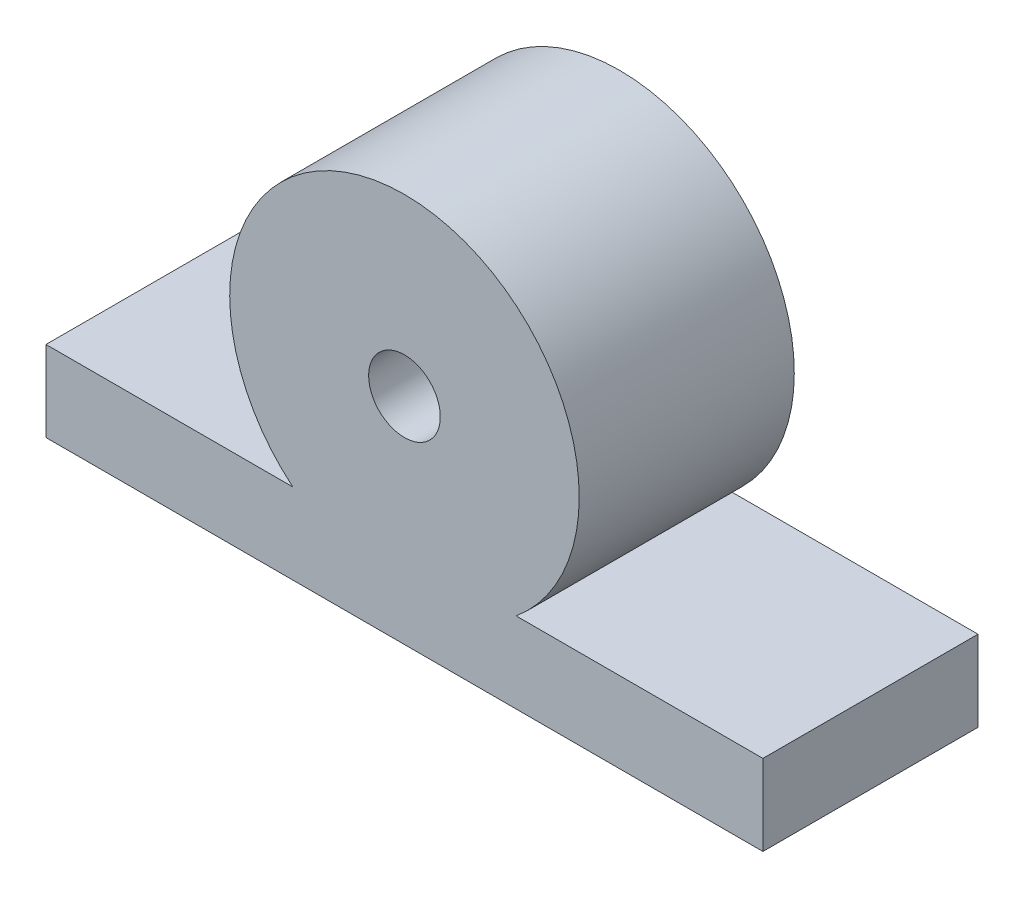
ISO-10303-21;
HEADER;
FILE_DESCRIPTION(('STEP AP214'),'2;1');
FILE_NAME('part.step','',(''),(''),'','','');
FILE_SCHEMA(('AUTOMOTIVE_DESIGN { 1 0 10303 214 1 1 1 1 }'));
ENDSEC;
DATA;
#1=APPLICATION_CONTEXT('core data for automotive mechanical design processes');
#2=APPLICATION_PROTOCOL_DEFINITION('international standard','automotive_design',2000,#1);
#3=PRODUCT_CONTEXT('',#1,'mechanical');
#4=PRODUCT('Part','Part','',(#3));
#5=PRODUCT_RELATED_PRODUCT_CATEGORY('part','',(#4));
#6=PRODUCT_DEFINITION_FORMATION('','',#4);
#7=PRODUCT_DEFINITION_CONTEXT('part definition',#1,'design');
#8=PRODUCT_DEFINITION('design','',#6,#7);
#9=PRODUCT_DEFINITION_SHAPE('','',#8);
#10=(LENGTH_UNIT() NAMED_UNIT(*) SI_UNIT(.MILLI.,.METRE.));
#11=(NAMED_UNIT(*) PLANE_ANGLE_UNIT() SI_UNIT($,.RADIAN.));
#12=(NAMED_UNIT(*) SI_UNIT($,.STERADIAN.) SOLID_ANGLE_UNIT());
#13=UNCERTAINTY_MEASURE_WITH_UNIT(LENGTH_MEASURE(1.E-05),#10,'distance_accuracy_value','');
#14=(GEOMETRIC_REPRESENTATION_CONTEXT(3) GLOBAL_UNCERTAINTY_ASSIGNED_CONTEXT((#13)) GLOBAL_UNIT_ASSIGNED_CONTEXT((#10,
#11,#12)) REPRESENTATION_CONTEXT('',''));
#15=CARTESIAN_POINT('',(0.,0.,0.));
#16=DIRECTION('',(0.,0.,1.));
#17=DIRECTION('',(1.,0.,0.));
#18=AXIS2_PLACEMENT_3D('',#15,#16,#17);
#19=CARTESIAN_POINT('',(0.,38.1,38.1));
#20=DIRECTION('',(0.,0.,-1.));
#21=DIRECTION('',(-1.,0.,0.));
#22=AXIS2_PLACEMENT_3D('',#19,#20,#21);
#23=CYLINDRICAL_SURFACE('',#22,30.95625);
#24=CARTESIAN_POINT('',(0.,38.1,0.));
#25=DIRECTION('',(0.,0.,1.));
#26=DIRECTION('',(1.,0.,0.));
#27=AXIS2_PLACEMENT_3D('',#24,#25,#26);
#28=CIRCLE('',#27,30.95625);
#29=CARTESIAN_POINT('',(19.7801480735737,14.2875,0.));
#30=VERTEX_POINT('',#29);
#31=CARTESIAN_POINT('',(-19.7801480735737,14.2875,0.));
#32=VERTEX_POINT('',#31);
#33=EDGE_CURVE('E123',#30,#32,#28,.T.);
#34=ORIENTED_EDGE('',*,*,#33,.T.);
#35=DIRECTION('',(0.,0.,-1.));
#36=VECTOR('',#35,1.);
#37=CARTESIAN_POINT('',(-19.7801480735737,14.2875,38.1));
#38=LINE('',#37,#36);
#39=CARTESIAN_POINT('',(-19.7801480735737,14.2875,38.1));
#40=VERTEX_POINT('',#39);
#41=EDGE_CURVE('E11',#40,#32,#38,.T.);
#42=ORIENTED_EDGE('',*,*,#41,.F.);
#43=CARTESIAN_POINT('',(0.,38.1,38.1));
#44=DIRECTION('',(0.,0.,1.));
#45=DIRECTION('',(1.,0.,0.));
#46=AXIS2_PLACEMENT_3D('',#43,#44,#45);
#47=CIRCLE('',#46,30.95625);
#48=CARTESIAN_POINT('',(19.7801480735737,14.2875,38.1));
#49=VERTEX_POINT('',#48);
#50=EDGE_CURVE('E85',#49,#40,#47,.T.);
#51=ORIENTED_EDGE('',*,*,#50,.F.);
#52=DIRECTION('',(0.,0.,-1.));
#53=VECTOR('',#52,1.);
#54=CARTESIAN_POINT('',(19.7801480735737,14.2875,38.1));
#55=LINE('',#54,#53);
#56=EDGE_CURVE('E54',#49,#30,#55,.T.);
#57=ORIENTED_EDGE('',*,*,#56,.T.);
#58=EDGE_LOOP('',(#34,#42,#51,#57));
#59=FACE_BOUND('',#58,.T.);
#60=ADVANCED_FACE('F37',(#59),#23,.T.);
#61=CARTESIAN_POINT('',(0.,14.2875,38.1));
#62=DIRECTION('',(0.,1.,0.));
#63=DIRECTION('',(-1.,0.,0.));
#64=AXIS2_PLACEMENT_3D('',#61,#62,#63);
#65=PLANE('',#64);
#66=DIRECTION('',(1.,0.,0.));
#67=VECTOR('',#66,1.);
#68=CARTESIAN_POINT('',(0.,14.2875,0.));
#69=LINE('',#68,#67);
#70=CARTESIAN_POINT('',(-63.5,14.2875,0.));
#71=VERTEX_POINT('',#70);
#72=EDGE_CURVE('E125',#71,#32,#69,.T.);
#73=ORIENTED_EDGE('',*,*,#72,.F.);
#74=DIRECTION('',(0.,0.,-1.));
#75=VECTOR('',#74,1.);
#76=CARTESIAN_POINT('',(-63.5,14.2875,38.1));
#77=LINE('',#76,#75);
#78=CARTESIAN_POINT('',(-63.5,14.2875,38.1));
#79=VERTEX_POINT('',#78);
#80=EDGE_CURVE('E46',#79,#71,#77,.T.);
#81=ORIENTED_EDGE('',*,*,#80,.F.);
#82=DIRECTION('',(1.,0.,0.));
#83=VECTOR('',#82,1.);
#84=CARTESIAN_POINT('',(0.,14.2875,38.1));
#85=LINE('',#84,#83);
#86=EDGE_CURVE('E249',#79,#40,#85,.T.);
#87=ORIENTED_EDGE('',*,*,#86,.T.);
#88=ORIENTED_EDGE('',*,*,#41,.T.);
#89=EDGE_LOOP('',(#73,#81,#87,#88));
#90=FACE_BOUND('',#89,.T.);
#91=ADVANCED_FACE('F146',(#90),#65,.T.);
#92=CARTESIAN_POINT('',(-63.5,0.,38.1));
#93=DIRECTION('',(-1.,0.,0.));
#94=DIRECTION('',(0.,0.,1.));
#95=AXIS2_PLACEMENT_3D('',#92,#93,#94);
#96=PLANE('',#95);
#97=DIRECTION('',(0.,1.,0.));
#98=VECTOR('',#97,1.);
#99=CARTESIAN_POINT('',(-63.5,0.,0.));
#100=LINE('',#99,#98);
#101=CARTESIAN_POINT('',(-63.5,0.,0.));
#102=VERTEX_POINT('',#101);
#103=EDGE_CURVE('E128',#102,#71,#100,.T.);
#104=ORIENTED_EDGE('',*,*,#103,.F.);
#105=DIRECTION('',(0.,0.,-1.));
#106=VECTOR('',#105,1.);
#107=CARTESIAN_POINT('',(-63.5,0.,38.1));
#108=LINE('',#107,#106);
#109=CARTESIAN_POINT('',(-63.5,0.,38.1));
#110=VERTEX_POINT('',#109);
#111=EDGE_CURVE('E112',#110,#102,#108,.T.);
#112=ORIENTED_EDGE('',*,*,#111,.F.);
#113=DIRECTION('',(0.,1.,0.));
#114=VECTOR('',#113,1.);
#115=CARTESIAN_POINT('',(-63.5,0.,38.1));
#116=LINE('',#115,#114);
#117=EDGE_CURVE('E102',#110,#79,#116,.T.);
#118=ORIENTED_EDGE('',*,*,#117,.T.);
#119=ORIENTED_EDGE('',*,*,#80,.T.);
#120=EDGE_LOOP('',(#104,#112,#118,#119));
#121=FACE_BOUND('',#120,.T.);
#122=ADVANCED_FACE('F143',(#121),#96,.T.);
#123=CARTESIAN_POINT('',(0.,0.,38.1));
#124=DIRECTION('',(0.,1.,0.));
#125=DIRECTION('',(-1.,0.,0.));
#126=AXIS2_PLACEMENT_3D('',#123,#124,#125);
#127=PLANE('',#126);
#128=DIRECTION('',(1.,0.,0.));
#129=VECTOR('',#128,1.);
#130=CARTESIAN_POINT('',(0.,0.,0.));
#131=LINE('',#130,#129);
#132=CARTESIAN_POINT('',(63.5,0.,0.));
#133=VERTEX_POINT('',#132);
#134=EDGE_CURVE('E109',#102,#133,#131,.T.);
#135=ORIENTED_EDGE('',*,*,#134,.T.);
#136=DIRECTION('',(0.,0.,-1.));
#137=VECTOR('',#136,1.);
#138=CARTESIAN_POINT('',(63.5,0.,38.1));
#139=LINE('',#138,#137);
#140=CARTESIAN_POINT('',(63.5,0.,38.1));
#141=VERTEX_POINT('',#140);
#142=EDGE_CURVE('E106',#141,#133,#139,.T.);
#143=ORIENTED_EDGE('',*,*,#142,.F.);
#144=DIRECTION('',(1.,0.,0.));
#145=VECTOR('',#144,1.);
#146=CARTESIAN_POINT('',(0.,0.,38.1));
#147=LINE('',#146,#145);
#148=EDGE_CURVE('E96',#110,#141,#147,.T.);
#149=ORIENTED_EDGE('',*,*,#148,.F.);
#150=ORIENTED_EDGE('',*,*,#111,.T.);
#151=EDGE_LOOP('',(#135,#143,#149,#150));
#152=FACE_BOUND('',#151,.T.);
#153=ADVANCED_FACE('F107',(#152),#127,.F.);
#154=CARTESIAN_POINT('',(63.5,0.,38.1));
#155=DIRECTION('',(1.,0.,0.));
#156=DIRECTION('',(0.,0.,-1.));
#157=AXIS2_PLACEMENT_3D('',#154,#155,#156);
#158=PLANE('',#157);
#159=DIRECTION('',(0.,-1.,0.));
#160=VECTOR('',#159,1.);
#161=CARTESIAN_POINT('',(63.5,0.,0.));
#162=LINE('',#161,#160);
#163=CARTESIAN_POINT('',(63.5,14.2875,0.));
#164=VERTEX_POINT('',#163);
#165=EDGE_CURVE('E132',#164,#133,#162,.T.);
#166=ORIENTED_EDGE('',*,*,#165,.F.);
#167=DIRECTION('',(0.,0.,-1.));
#168=VECTOR('',#167,1.);
#169=CARTESIAN_POINT('',(63.5,14.2875,38.1));
#170=LINE('',#169,#168);
#171=CARTESIAN_POINT('',(63.5,14.2875,38.1));
#172=VERTEX_POINT('',#171);
#173=EDGE_CURVE('E73',#172,#164,#170,.T.);
#174=ORIENTED_EDGE('',*,*,#173,.F.);
#175=DIRECTION('',(0.,-1.,0.));
#176=VECTOR('',#175,1.);
#177=CARTESIAN_POINT('',(63.5,0.,38.1));
#178=LINE('',#177,#176);
#179=EDGE_CURVE('E100',#172,#141,#178,.T.);
#180=ORIENTED_EDGE('',*,*,#179,.T.);
#181=ORIENTED_EDGE('',*,*,#142,.T.);
#182=EDGE_LOOP('',(#166,#174,#180,#181));
#183=FACE_BOUND('',#182,.T.);
#184=ADVANCED_FACE('F114',(#183),#158,.T.);
#185=CARTESIAN_POINT('',(0.,38.1,38.1));
#186=DIRECTION('',(0.,0.,-1.));
#187=DIRECTION('',(-1.,0.,0.));
#188=AXIS2_PLACEMENT_3D('',#185,#186,#187);
#189=CYLINDRICAL_SURFACE('',#188,6.35);
#190=CARTESIAN_POINT('',(0.,38.1,38.1));
#191=DIRECTION('',(0.,0.,1.));
#192=DIRECTION('',(1.,0.,0.));
#193=AXIS2_PLACEMENT_3D('',#190,#191,#192);
#194=CIRCLE('',#193,6.35);
#195=CARTESIAN_POINT('',(-6.35,38.1,38.1));
#196=VERTEX_POINT('',#195);
#197=EDGE_CURVE('E137',#196,#196,#194,.T.);
#198=CARTESIAN_POINT('',(0.,38.1,0.));
#199=DIRECTION('',(0.,0.,1.));
#200=DIRECTION('',(1.,0.,0.));
#201=AXIS2_PLACEMENT_3D('',#198,#199,#200);
#202=CIRCLE('',#201,6.35);
#203=CARTESIAN_POINT('',(-6.35,38.1,0.));
#204=VERTEX_POINT('',#203);
#205=EDGE_CURVE('E120',#204,#204,#202,.T.);
#206=CARTESIAN_POINT('',(-6.35,38.1,38.1));
#207=CARTESIAN_POINT('',(-6.35,38.1,37.703125));
#208=CARTESIAN_POINT('',(-6.35,38.1,37.30625));
#209=CARTESIAN_POINT('',(-6.35,38.1,36.5125));
#210=CARTESIAN_POINT('',(-6.35,38.1,36.115625));
#211=CARTESIAN_POINT('',(-6.35,38.1,35.321875));
#212=CARTESIAN_POINT('',(-6.35,38.1,34.925));
#213=CARTESIAN_POINT('',(-6.35,38.1,34.13125));
#214=CARTESIAN_POINT('',(-6.35,38.1,33.734375));
#215=CARTESIAN_POINT('',(-6.35,38.1,32.940625));
#216=CARTESIAN_POINT('',(-6.35,38.1,32.54375));
#217=CARTESIAN_POINT('',(-6.35,38.1,31.75));
#218=CARTESIAN_POINT('',(-6.35,38.1,31.353125));
#219=CARTESIAN_POINT('',(-6.35,38.1,30.559375));
#220=CARTESIAN_POINT('',(-6.35,38.1,30.1625));
#221=CARTESIAN_POINT('',(-6.35,38.1,29.36875));
#222=CARTESIAN_POINT('',(-6.35,38.1,28.971875));
#223=CARTESIAN_POINT('',(-6.35,38.1,28.178125));
#224=CARTESIAN_POINT('',(-6.35,38.1,27.78125));
#225=CARTESIAN_POINT('',(-6.35,38.1,26.9875));
#226=CARTESIAN_POINT('',(-6.35,38.1,26.590625));
#227=CARTESIAN_POINT('',(-6.35,38.1,25.796875));
#228=CARTESIAN_POINT('',(-6.35,38.1,25.4));
#229=CARTESIAN_POINT('',(-6.35,38.1,24.60625));
#230=CARTESIAN_POINT('',(-6.35,38.1,24.209375));
#231=CARTESIAN_POINT('',(-6.35,38.1,23.415625));
#232=CARTESIAN_POINT('',(-6.35,38.1,23.01875));
#233=CARTESIAN_POINT('',(-6.35,38.1,22.225));
#234=CARTESIAN_POINT('',(-6.35,38.1,21.828125));
#235=CARTESIAN_POINT('',(-6.35,38.1,21.034375));
#236=CARTESIAN_POINT('',(-6.35,38.1,20.6375));
#237=CARTESIAN_POINT('',(-6.35,38.1,19.84375));
#238=CARTESIAN_POINT('',(-6.35,38.1,19.446875));
#239=CARTESIAN_POINT('',(-6.35,38.1,18.653125));
#240=CARTESIAN_POINT('',(-6.35,38.1,18.25625));
#241=CARTESIAN_POINT('',(-6.35,38.1,17.4625));
#242=CARTESIAN_POINT('',(-6.35,38.1,17.065625));
#243=CARTESIAN_POINT('',(-6.35,38.1,16.271875));
#244=CARTESIAN_POINT('',(-6.35,38.1,15.875));
#245=CARTESIAN_POINT('',(-6.35,38.1,15.08125));
#246=CARTESIAN_POINT('',(-6.35,38.1,14.684375));
#247=CARTESIAN_POINT('',(-6.35,38.1,13.890625));
#248=CARTESIAN_POINT('',(-6.35,38.1,13.49375));
#249=CARTESIAN_POINT('',(-6.35,38.1,12.7));
#250=CARTESIAN_POINT('',(-6.35,38.1,12.303125));
#251=CARTESIAN_POINT('',(-6.35,38.1,11.509375));
#252=CARTESIAN_POINT('',(-6.35,38.1,11.1125));
#253=CARTESIAN_POINT('',(-6.35,38.1,10.31875));
#254=CARTESIAN_POINT('',(-6.35,38.1,9.921875));
#255=CARTESIAN_POINT('',(-6.35,38.1,9.128125));
#256=CARTESIAN_POINT('',(-6.35,38.1,8.73125));
#257=CARTESIAN_POINT('',(-6.35,38.1,7.9375));
#258=CARTESIAN_POINT('',(-6.35,38.1,7.540625));
#259=CARTESIAN_POINT('',(-6.35,38.1,6.746875));
#260=CARTESIAN_POINT('',(-6.35,38.1,6.35));
#261=CARTESIAN_POINT('',(-6.35,38.1,5.55625));
#262=CARTESIAN_POINT('',(-6.35,38.1,5.159375));
#263=CARTESIAN_POINT('',(-6.35,38.1,4.365625));
#264=CARTESIAN_POINT('',(-6.35,38.1,3.96875));
#265=CARTESIAN_POINT('',(-6.35,38.1,3.175));
#266=CARTESIAN_POINT('',(-6.35,38.1,2.778125));
#267=CARTESIAN_POINT('',(-6.35,38.1,1.984375));
#268=CARTESIAN_POINT('',(-6.35,38.1,1.5875));
#269=CARTESIAN_POINT('',(-6.35,38.1,0.79375));
#270=CARTESIAN_POINT('',(-6.35,38.1,0.396875));
#271=CARTESIAN_POINT('',(-6.35,38.1,0.));
#272=B_SPLINE_CURVE_WITH_KNOTS('',3,(#206,#207,#208,#209,#210,#211,#212,#213,#214,#215,#216,
#217,#218,#219,#220,#221,#222,#223,#224,#225,#226,#227,#228,#229,#230,#231,#232,#233,#234,#235,
#236,#237,#238,#239,#240,#241,#242,#243,#244,#245,#246,#247,#248,#249,#250,#251,#252,#253,#254,
#255,#256,#257,#258,#259,#260,#261,#262,#263,#264,#265,#266,#267,#268,#269,#270,#271),
.UNSPECIFIED.,.F.,.F.,(4,2,2,2,2,2,2,2,2,2,2,2,2,2,2,2,2,2,2,2,2,2,2,2,2,2,2,2,2,2,2,2,4),(0.,
1.19062499999999,2.38124999999999,3.571875,4.7625,5.953125,7.14375,8.33437499999999,9.525,
10.715625,11.90625,13.096875,14.2875,15.478125,16.66875,17.859375,19.05,20.240625,21.43125,
22.621875,23.8125,25.003125,26.19375,27.384375,28.575,29.765625,30.95625,32.146875,33.3375,
34.528125,35.71875,36.909375,38.1),.UNSPECIFIED.);
#273=EDGE_CURVE('BSEAM39',#196,#204,#272,.T.);
#274=ORIENTED_EDGE('',*,*,#197,.T.);
#275=ORIENTED_EDGE('',*,*,#205,.F.);
#276=ORIENTED_EDGE('',*,*,#273,.T.);
#277=ORIENTED_EDGE('',*,*,#273,.F.);
#278=EDGE_LOOP('',(#274,#276,#275,#277));
#279=FACE_BOUND('',#278,.T.);
#280=ADVANCED_FACE('F39',(#279),#189,.F.);
#281=CARTESIAN_POINT('',(0.,14.2875,38.1));
#282=DIRECTION('',(0.,1.,0.));
#283=DIRECTION('',(-1.,0.,0.));
#284=AXIS2_PLACEMENT_3D('',#281,#282,#283);
#285=PLANE('',#284);
#286=DIRECTION('',(1.,0.,0.));
#287=VECTOR('',#286,1.);
#288=CARTESIAN_POINT('',(0.,14.2875,0.));
#289=LINE('',#288,#287);
#290=EDGE_CURVE('E134',#30,#164,#289,.T.);
#291=ORIENTED_EDGE('',*,*,#290,.F.);
#292=ORIENTED_EDGE('',*,*,#56,.F.);
#293=DIRECTION('',(1.,0.,0.));
#294=VECTOR('',#293,1.);
#295=CARTESIAN_POINT('',(0.,14.2875,38.1));
#296=LINE('',#295,#294);
#297=EDGE_CURVE('E115',#49,#172,#296,.T.);
#298=ORIENTED_EDGE('',*,*,#297,.T.);
#299=ORIENTED_EDGE('',*,*,#173,.T.);
#300=EDGE_LOOP('',(#291,#292,#298,#299));
#301=FACE_BOUND('',#300,.T.);
#302=ADVANCED_FACE('F149',(#301),#285,.T.);
#303=CARTESIAN_POINT('',(0.,0.,38.1));
#304=DIRECTION('',(0.,0.,1.));
#305=DIRECTION('',(1.,0.,0.));
#306=AXIS2_PLACEMENT_3D('',#303,#304,#305);
#307=PLANE('',#306);
#308=ORIENTED_EDGE('',*,*,#197,.F.);
#309=EDGE_LOOP('',(#308));
#310=FACE_BOUND('',#309,.T.);
#311=ORIENTED_EDGE('',*,*,#50,.T.);
#312=ORIENTED_EDGE('',*,*,#86,.F.);
#313=ORIENTED_EDGE('',*,*,#117,.F.);
#314=ORIENTED_EDGE('',*,*,#148,.T.);
#315=ORIENTED_EDGE('',*,*,#179,.F.);
#316=ORIENTED_EDGE('',*,*,#297,.F.);
#317=EDGE_LOOP('',(#311,#312,#313,#314,#315,#316));
#318=FACE_BOUND('',#317,.T.);
#319=ADVANCED_FACE('F98',(#310,#318),#307,.T.);
#320=CARTESIAN_POINT('',(0.,0.,0.));
#321=DIRECTION('',(0.,0.,1.));
#322=DIRECTION('',(1.,0.,0.));
#323=AXIS2_PLACEMENT_3D('',#320,#321,#322);
#324=PLANE('',#323);
#325=ORIENTED_EDGE('',*,*,#205,.T.);
#326=EDGE_LOOP('',(#325));
#327=FACE_BOUND('',#326,.T.);
#328=ORIENTED_EDGE('',*,*,#33,.F.);
#329=ORIENTED_EDGE('',*,*,#290,.T.);
#330=ORIENTED_EDGE('',*,*,#165,.T.);
#331=ORIENTED_EDGE('',*,*,#134,.F.);
#332=ORIENTED_EDGE('',*,*,#103,.T.);
#333=ORIENTED_EDGE('',*,*,#72,.T.);
#334=EDGE_LOOP('',(#328,#329,#330,#331,#332,#333));
#335=FACE_BOUND('',#334,.T.);
#336=ADVANCED_FACE('F148',(#327,#335),#324,.F.);
#337=CLOSED_SHELL('',(#60,#91,#122,#153,#184,#280,#302,#319,#336));
#338=MANIFOLD_SOLID_BREP('B2',#337);
#339=ADVANCED_BREP_SHAPE_REPRESENTATION('',(#18,#338),#14);
#340=SHAPE_DEFINITION_REPRESENTATION(#9,#339);
ENDSEC;
END-ISO-10303-21;
